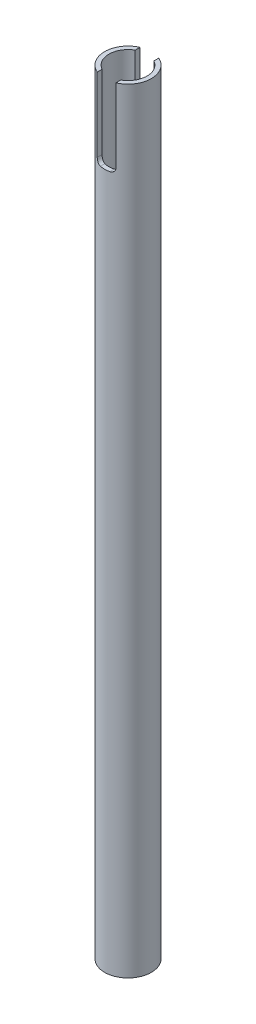
ISO-10303-21;
HEADER;
FILE_DESCRIPTION(('STEP AP214'),'2;1');
FILE_NAME('part.step','',(''),(''),'','','');
FILE_SCHEMA(('AUTOMOTIVE_DESIGN { 1 0 10303 214 1 1 1 1 }'));
ENDSEC;
DATA;
#1=APPLICATION_CONTEXT('core data for automotive mechanical design processes');
#2=APPLICATION_PROTOCOL_DEFINITION('international standard','automotive_design',2000,#1);
#3=PRODUCT_CONTEXT('',#1,'mechanical');
#4=PRODUCT('Part','Part','',(#3));
#5=PRODUCT_RELATED_PRODUCT_CATEGORY('part','',(#4));
#6=PRODUCT_DEFINITION_FORMATION('','',#4);
#7=PRODUCT_DEFINITION_CONTEXT('part definition',#1,'design');
#8=PRODUCT_DEFINITION('design','',#6,#7);
#9=PRODUCT_DEFINITION_SHAPE('','',#8);
#10=(LENGTH_UNIT() NAMED_UNIT(*) SI_UNIT(.MILLI.,.METRE.));
#11=(NAMED_UNIT(*) PLANE_ANGLE_UNIT() SI_UNIT($,.RADIAN.));
#12=(NAMED_UNIT(*) SI_UNIT($,.STERADIAN.) SOLID_ANGLE_UNIT());
#13=UNCERTAINTY_MEASURE_WITH_UNIT(LENGTH_MEASURE(1.E-05),#10,'distance_accuracy_value','');
#14=(GEOMETRIC_REPRESENTATION_CONTEXT(3) GLOBAL_UNCERTAINTY_ASSIGNED_CONTEXT((#13)) GLOBAL_UNIT_ASSIGNED_CONTEXT((#10,
#11,#12)) REPRESENTATION_CONTEXT('',''));
#15=CARTESIAN_POINT('',(0.,0.,0.));
#16=DIRECTION('',(0.,0.,1.));
#17=DIRECTION('',(1.,0.,0.));
#18=AXIS2_PLACEMENT_3D('',#15,#16,#17);
#19=CARTESIAN_POINT('',(3.17499999999999,138.491838411301,0.));
#20=DIRECTION('',(0.,1.,0.));
#21=DIRECTION('',(0.,0.,1.));
#22=AXIS2_PLACEMENT_3D('',#19,#20,#21);
#23=PLANE('',#22);
#24=DIRECTION('',(0.,0.,1.));
#25=VECTOR('',#24,1.);
#26=CARTESIAN_POINT('',(-3.17499999999999,138.491838411301,0.));
#27=LINE('',#26,#25);
#28=CARTESIAN_POINT('',(-3.17499999999999,138.491838411301,-7.2748389157424));
#29=VERTEX_POINT('',#28);
#30=CARTESIAN_POINT('',(-3.17499999999999,138.491838411301,-5.63085690548074));
#31=VERTEX_POINT('',#30);
#32=EDGE_CURVE('E173',#29,#31,#27,.T.);
#33=ORIENTED_EDGE('',*,*,#32,.F.);
#34=CARTESIAN_POINT('',(0.,138.491838411301,0.));
#35=DIRECTION('',(0.,1.,0.));
#36=DIRECTION('',(0.,0.,1.));
#37=AXIS2_PLACEMENT_3D('',#34,#35,#36);
#38=CIRCLE('',#37,7.9375);
#39=CARTESIAN_POINT('',(-3.17499999999999,138.491838411301,7.2748389157424));
#40=VERTEX_POINT('',#39);
#41=EDGE_CURVE('E151',#29,#40,#38,.T.);
#42=ORIENTED_EDGE('',*,*,#41,.T.);
#43=CARTESIAN_POINT('',(-3.17499999999999,138.491838411301,5.63085690548074));
#44=VERTEX_POINT('',#43);
#45=EDGE_CURVE('E171',#44,#40,#27,.T.);
#46=ORIENTED_EDGE('',*,*,#45,.F.);
#47=CARTESIAN_POINT('',(0.,138.491838411301,0.));
#48=DIRECTION('',(0.,1.,0.));
#49=DIRECTION('',(0.,0.,1.));
#50=AXIS2_PLACEMENT_3D('',#47,#48,#49);
#51=CIRCLE('',#50,6.4643);
#52=EDGE_CURVE('E169',#31,#44,#51,.T.);
#53=ORIENTED_EDGE('',*,*,#52,.F.);
#54=EDGE_LOOP('',(#33,#42,#46,#53));
#55=FACE_BOUND('',#54,.T.);
#56=ADVANCED_FACE('F37',(#55),#23,.T.);
#57=CARTESIAN_POINT('',(0.,186.342478713974,0.));
#58=DIRECTION('',(0.,-1.,0.));
#59=DIRECTION('',(0.,0.,-1.));
#60=AXIS2_PLACEMENT_3D('',#57,#58,#59);
#61=CYLINDRICAL_SURFACE('',#60,7.9375);
#62=CARTESIAN_POINT('',(0.,-124.460533205229,0.));
#63=DIRECTION('',(0.,1.,0.));
#64=DIRECTION('',(0.,0.,1.));
#65=AXIS2_PLACEMENT_3D('',#62,#63,#64);
#66=CIRCLE('',#65,7.9375);
#67=CARTESIAN_POINT('',(0.,-124.460533205229,7.9375));
#68=VERTEX_POINT('',#67);
#69=EDGE_CURVE('E154',#68,#68,#66,.T.);
#70=ORIENTED_EDGE('',*,*,#69,.T.);
#71=EDGE_LOOP('',(#70));
#72=FACE_BOUND('',#71,.T.);
#73=CARTESIAN_POINT('',(1.58749999999998,111.821838411301,-7.77712993333659));
#74=CARTESIAN_POINT('',(1.63350676862771,111.821838654892,-7.76774126330065));
#75=CARTESIAN_POINT('',(1.67940359564175,111.823839316009,-7.75794444810862));
#76=CARTESIAN_POINT('',(1.7706803958091,111.831776679327,-7.73762089991974));
#77=CARTESIAN_POINT('',(1.81606050148703,111.837712348075,-7.72709435922088));
#78=CARTESIAN_POINT('',(1.95078228156832,111.861285297326,-7.6945984520111));
#79=CARTESIAN_POINT('',(2.03894812030821,111.884689244249,-7.6716629936863));
#80=CARTESIAN_POINT('',(2.20953807004375,111.94596944142,-7.62428385726794));
#81=CARTESIAN_POINT('',(2.29196515383514,111.98383813168,-7.59984097261638));
#82=CARTESIAN_POINT('',(2.44917385980104,112.072985401722,-7.55064502184107));
#83=CARTESIAN_POINT('',(2.52395227814498,112.124269569167,-7.52589183057165));
#84=CARTESIAN_POINT('',(2.66543932718693,112.240256617122,-7.47696931777062));
#85=CARTESIAN_POINT('',(2.73193883493113,112.305225342237,-7.4528241459836));
#86=CARTESIAN_POINT('',(2.85299322074861,112.44636355607,-7.40732925012122));
#87=CARTESIAN_POINT('',(2.90754767783192,112.522533439402,-7.38597962458243));
#88=CARTESIAN_POINT('',(3.00159155783954,112.682107139886,-7.34825600672415));
#89=CARTESIAN_POINT('',(3.0414245229115,112.765281595146,-7.33177064627855));
#90=CARTESIAN_POINT('',(3.10622330269325,112.938052227247,-7.30455577634144));
#91=CARTESIAN_POINT('',(3.13121458917043,113.027637104415,-7.2938164085495));
#92=CARTESIAN_POINT('',(3.15710194076299,113.166684924183,-7.28263004031742));
#93=CARTESIAN_POINT('',(3.16380495831027,113.214940151024,-7.27971714426164));
#94=CARTESIAN_POINT('',(3.17275416759983,113.311899569453,-7.27581937849741));
#95=CARTESIAN_POINT('',(3.17500392571315,113.360603370371,-7.27483296598248));
#96=CARTESIAN_POINT('',(3.17499999999999,113.409338411301,-7.2748389157424));
#97=B_SPLINE_CURVE_WITH_KNOTS('',3,(#73,#74,#75,#76,#77,#78,#79,#80,#81,#82,#83,#84,#85,#86,#87,
#88,#89,#90,#91,#92,#93,#94,#95,#96),.UNSPECIFIED.,.F.,.F.,(4,2,2,2,2,2,2,2,2,2,2,4),(0.,
0.140770845296606,0.28150473451401,0.562238948643035,0.842826637517777,1.12353138019526,
1.41029752992664,1.69707378478449,1.97665708187306,2.255759151943,2.40195937855944,
2.54804247399298),.UNSPECIFIED.);
#98=CARTESIAN_POINT('',(1.58749999999998,111.821838411301,-7.77712993333659));
#99=VERTEX_POINT('',#98);
#100=CARTESIAN_POINT('',(3.17499999999998,113.409338411301,-7.2748389157424));
#101=VERTEX_POINT('',#100);
#102=EDGE_CURVE('E147',#99,#101,#97,.T.);
#103=ORIENTED_EDGE('',*,*,#102,.T.);
#104=DIRECTION('',(0.,-1.,0.));
#105=VECTOR('',#104,1.);
#106=CARTESIAN_POINT('',(3.175,186.342478713974,-7.2748389157424));
#107=LINE('',#106,#105);
#108=CARTESIAN_POINT('',(3.17499999999999,138.491838411301,-7.2748389157424));
#109=VERTEX_POINT('',#108);
#110=EDGE_CURVE('E134',#101,#109,#107,.F.);
#111=ORIENTED_EDGE('',*,*,#110,.T.);
#112=CARTESIAN_POINT('',(3.17499999999999,138.491838411301,7.2748389157424));
#113=VERTEX_POINT('',#112);
#114=EDGE_CURVE('E141',#113,#109,#38,.T.);
#115=ORIENTED_EDGE('',*,*,#114,.F.);
#116=DIRECTION('',(0.,-1.,0.));
#117=VECTOR('',#116,1.);
#118=CARTESIAN_POINT('',(3.175,186.342478713974,7.2748389157424));
#119=LINE('',#118,#117);
#120=CARTESIAN_POINT('',(3.17499999999998,113.409338411301,7.27483891574241));
#121=VERTEX_POINT('',#120);
#122=EDGE_CURVE('E59',#113,#121,#119,.T.);
#123=ORIENTED_EDGE('',*,*,#122,.T.);
#124=CARTESIAN_POINT('',(3.17499999999999,113.409338411301,7.2748389157424));
#125=CARTESIAN_POINT('',(3.17500168113658,113.366966859319,7.27483586366098));
#126=CARTESIAN_POINT('',(3.17330245165567,113.324617163656,7.27558001702576));
#127=CARTESIAN_POINT('',(3.16653661877878,113.240251349186,7.278528185394));
#128=CARTESIAN_POINT('',(3.16147102917758,113.198235133804,7.28073176088512));
#129=CARTESIAN_POINT('',(3.14133450163408,113.07345277579,7.28945465778902));
#130=CARTESIAN_POINT('',(3.12132308750013,112.9915724567,7.29808678684577));
#131=CARTESIAN_POINT('',(3.06894040253671,112.832714568699,7.32026684625099));
#132=CARTESIAN_POINT('',(3.03657783085926,112.755733593512,7.33381131641251));
#133=CARTESIAN_POINT('',(2.96061234627714,112.608341013137,7.36480545430106));
#134=CARTESIAN_POINT('',(2.91700139314277,112.537934156296,7.38225791423853));
#135=CARTESIAN_POINT('',(2.81767453343913,112.402259867427,7.42075264717217));
#136=CARTESIAN_POINT('',(2.76150754869699,112.337358857665,7.44191980144859));
#137=CARTESIAN_POINT('',(2.63982081610502,112.21767333396,7.48594933347427));
#138=CARTESIAN_POINT('',(2.5742973865362,112.162892821943,7.50881237683835));
#139=CARTESIAN_POINT('',(2.43069507728351,112.061215434871,7.5565684344493));
#140=CARTESIAN_POINT('',(2.35206470826202,112.015110905896,7.58149355937879));
#141=CARTESIAN_POINT('',(2.18789362747877,111.936945301696,7.63048866953837));
#142=CARTESIAN_POINT('',(2.10235659094259,111.90487681509,7.65455909988383));
#143=CARTESIAN_POINT('',(1.94541809174968,111.861051820317,7.6957350743198));
#144=CARTESIAN_POINT('',(1.87491037842446,111.846416715471,7.71322855066072));
#145=CARTESIAN_POINT('',(1.73219113401287,111.826800953617,7.74654000063457));
#146=CARTESIAN_POINT('',(1.65997981118742,111.821819122653,7.76235817778309));
#147=CARTESIAN_POINT('',(1.58749999999998,111.821838411301,7.77712993333659));
#148=B_SPLINE_CURVE_WITH_KNOTS('',3,(#124,#125,#126,#127,#128,#129,#130,#131,#132,#133,#134,
#135,#136,#137,#138,#139,#140,#141,#142,#143,#144,#145,#146,#147),.UNSPECIFIED.,.F.,.F.,(4,2,2,
2,2,2,2,2,2,2,2,4),(0.,0.127031494291929,0.254024749792393,0.506885265042634,0.759568013575099,
1.01243188015946,1.27651034681328,1.54069301498296,1.82289095795801,2.10493971303591,
2.326611113981,2.54825555529033),.UNSPECIFIED.);
#149=CARTESIAN_POINT('',(1.58749999999998,111.821838411301,7.77712993333659));
#150=VERTEX_POINT('',#149);
#151=EDGE_CURVE('E157',#121,#150,#148,.T.);
#152=ORIENTED_EDGE('',*,*,#151,.T.);
#153=CARTESIAN_POINT('',(0.,111.821838411301,0.));
#154=DIRECTION('',(0.,-1.,0.));
#155=DIRECTION('',(0.,0.,-1.));
#156=AXIS2_PLACEMENT_3D('',#153,#154,#155);
#157=CIRCLE('',#156,7.9375);
#158=CARTESIAN_POINT('',(-1.58749999999999,111.821838411301,7.7771299333366));
#159=VERTEX_POINT('',#158);
#160=EDGE_CURVE('E223',#150,#159,#157,.T.);
#161=ORIENTED_EDGE('',*,*,#160,.T.);
#162=CARTESIAN_POINT('',(-1.58749999999999,111.821838411301,7.7771299333366));
#163=CARTESIAN_POINT('',(-1.63350676862771,111.821838654892,7.76774126330065));
#164=CARTESIAN_POINT('',(-1.67940359564175,111.823839316009,7.75794444810862));
#165=CARTESIAN_POINT('',(-1.7706803958091,111.831776679327,7.73762089991974));
#166=CARTESIAN_POINT('',(-1.81606050148703,111.837712348075,7.72709435922088));
#167=CARTESIAN_POINT('',(-1.95078228156832,111.861285297326,7.6945984520111));
#168=CARTESIAN_POINT('',(-2.03894812030821,111.884689244249,7.6716629936863));
#169=CARTESIAN_POINT('',(-2.20953807004375,111.94596944142,7.62428385726794));
#170=CARTESIAN_POINT('',(-2.29196515383514,111.98383813168,7.59984097261638));
#171=CARTESIAN_POINT('',(-2.44917385980104,112.072985401722,7.55064502184107));
#172=CARTESIAN_POINT('',(-2.52395227814498,112.124269569167,7.52589183057165));
#173=CARTESIAN_POINT('',(-2.66543932718692,112.240256617122,7.47696931777063));
#174=CARTESIAN_POINT('',(-2.73193883493112,112.305225342237,7.4528241459836));
#175=CARTESIAN_POINT('',(-2.8529932207486,112.44636355607,7.40732925012122));
#176=CARTESIAN_POINT('',(-2.90754767783192,112.522533439402,7.38597962458243));
#177=CARTESIAN_POINT('',(-3.00159155783954,112.682107139886,7.34825600672415));
#178=CARTESIAN_POINT('',(-3.0414245229115,112.765281595146,7.33177064627855));
#179=CARTESIAN_POINT('',(-3.10622330269325,112.938052227247,7.30455577634144));
#180=CARTESIAN_POINT('',(-3.13121458917043,113.027637104415,7.2938164085495));
#181=CARTESIAN_POINT('',(-3.15710194076299,113.166684924183,7.28263004031742));
#182=CARTESIAN_POINT('',(-3.16380495831027,113.214940151024,7.27971714426164));
#183=CARTESIAN_POINT('',(-3.17275416759983,113.311899569453,7.27581937849741));
#184=CARTESIAN_POINT('',(-3.17500392571315,113.360603370371,7.27483296598248));
#185=CARTESIAN_POINT('',(-3.17499999999999,113.409338411301,7.2748389157424));
#186=B_SPLINE_CURVE_WITH_KNOTS('',3,(#162,#163,#164,#165,#166,#167,#168,#169,#170,#171,#172,
#173,#174,#175,#176,#177,#178,#179,#180,#181,#182,#183,#184,#185),.UNSPECIFIED.,.F.,.F.,(4,2,2,
2,2,2,2,2,2,2,2,4),(0.,0.140770845296606,0.28150473451401,0.562238948643035,0.842826637517777,
1.12353138019526,1.41029752992662,1.69707378478449,1.97665708187306,2.255759151943,
2.40195937855944,2.54804247399298),.UNSPECIFIED.);
#187=CARTESIAN_POINT('',(-3.17499999999999,113.409338411301,7.2748389157424));
#188=VERTEX_POINT('',#187);
#189=EDGE_CURVE('E213',#159,#188,#186,.T.);
#190=ORIENTED_EDGE('',*,*,#189,.T.);
#191=DIRECTION('',(0.,-1.,0.));
#192=VECTOR('',#191,1.);
#193=CARTESIAN_POINT('',(-3.175,186.342478713974,7.2748389157424));
#194=LINE('',#193,#192);
#195=EDGE_CURVE('E277',#188,#40,#194,.F.);
#196=ORIENTED_EDGE('',*,*,#195,.T.);
#197=ORIENTED_EDGE('',*,*,#41,.F.);
#198=DIRECTION('',(0.,-1.,0.));
#199=VECTOR('',#198,1.);
#200=CARTESIAN_POINT('',(-3.175,186.342478713974,-7.2748389157424));
#201=LINE('',#200,#199);
#202=CARTESIAN_POINT('',(-3.17499999999999,113.409338411301,-7.2748389157424));
#203=VERTEX_POINT('',#202);
#204=EDGE_CURVE('E214',#29,#203,#201,.T.);
#205=ORIENTED_EDGE('',*,*,#204,.T.);
#206=CARTESIAN_POINT('',(-3.17499999999999,113.409338411301,-7.2748389157424));
#207=CARTESIAN_POINT('',(-3.17500168113658,113.366966859319,-7.27483586366098));
#208=CARTESIAN_POINT('',(-3.17330245165567,113.324617163656,-7.27558001702576));
#209=CARTESIAN_POINT('',(-3.16653661877878,113.240251349186,-7.278528185394));
#210=CARTESIAN_POINT('',(-3.16147102917758,113.198235133804,-7.28073176088512));
#211=CARTESIAN_POINT('',(-3.14133450163408,113.07345277579,-7.28945465778902));
#212=CARTESIAN_POINT('',(-3.12132308750013,112.9915724567,-7.29808678684577));
#213=CARTESIAN_POINT('',(-3.06894040253671,112.832714568699,-7.32026684625099));
#214=CARTESIAN_POINT('',(-3.03657783085926,112.755733593512,-7.33381131641251));
#215=CARTESIAN_POINT('',(-2.96061234627714,112.608341013137,-7.36480545430106));
#216=CARTESIAN_POINT('',(-2.91700139314277,112.537934156296,-7.38225791423853));
#217=CARTESIAN_POINT('',(-2.81767453343913,112.402259867427,-7.42075264717217));
#218=CARTESIAN_POINT('',(-2.76150754869699,112.337358857665,-7.44191980144859));
#219=CARTESIAN_POINT('',(-2.63982081610502,112.21767333396,-7.48594933347427));
#220=CARTESIAN_POINT('',(-2.5742973865362,112.162892821943,-7.50881237683835));
#221=CARTESIAN_POINT('',(-2.43069507728351,112.061215434871,-7.5565684344493));
#222=CARTESIAN_POINT('',(-2.35206470826202,112.015110905896,-7.58149355937879));
#223=CARTESIAN_POINT('',(-2.18789362747877,111.936945301696,-7.63048866953837));
#224=CARTESIAN_POINT('',(-2.10235659094259,111.90487681509,-7.65455909988383));
#225=CARTESIAN_POINT('',(-1.94541809174968,111.861051820317,-7.6957350743198));
#226=CARTESIAN_POINT('',(-1.87491037842446,111.846416715471,-7.71322855066072));
#227=CARTESIAN_POINT('',(-1.73219113401287,111.826800953617,-7.74654000063457));
#228=CARTESIAN_POINT('',(-1.65997981118742,111.821819122653,-7.76235817778309));
#229=CARTESIAN_POINT('',(-1.58749999999998,111.821838411301,-7.7771299333366));
#230=B_SPLINE_CURVE_WITH_KNOTS('',3,(#206,#207,#208,#209,#210,#211,#212,#213,#214,#215,#216,
#217,#218,#219,#220,#221,#222,#223,#224,#225,#226,#227,#228,#229),.UNSPECIFIED.,.F.,.F.,(4,2,2,
2,2,2,2,2,2,2,2,4),(0.,0.127031494291929,0.254024749792393,0.506885265042634,0.7595680135751,
1.01243188015946,1.27651034681328,1.54069301498296,1.82289095795801,2.10493971303591,
2.326611113981,2.54825555529033),.UNSPECIFIED.);
#231=CARTESIAN_POINT('',(-1.58749999999999,111.821838411301,-7.77712993333659));
#232=VERTEX_POINT('',#231);
#233=EDGE_CURVE('E206',#203,#232,#230,.T.);
#234=ORIENTED_EDGE('',*,*,#233,.T.);
#235=EDGE_CURVE('E222',#232,#99,#157,.T.);
#236=ORIENTED_EDGE('',*,*,#235,.T.);
#237=EDGE_LOOP('',(#103,#111,#115,#123,#152,#161,#190,#196,#197,#205,#234,#236));
#238=FACE_BOUND('',#237,.T.);
#239=ADVANCED_FACE('F39',(#72,#238),#61,.T.);
#240=CARTESIAN_POINT('',(0.,-124.460533205229,0.));
#241=DIRECTION('',(0.,1.,0.));
#242=DIRECTION('',(0.,0.,1.));
#243=AXIS2_PLACEMENT_3D('',#240,#241,#242);
#244=PLANE('',#243);
#245=ORIENTED_EDGE('',*,*,#69,.F.);
#246=EDGE_LOOP('',(#245));
#247=FACE_BOUND('',#246,.T.);
#248=CARTESIAN_POINT('',(0.,-124.460533205229,0.));
#249=DIRECTION('',(0.,1.,0.));
#250=DIRECTION('',(0.,0.,1.));
#251=AXIS2_PLACEMENT_3D('',#248,#249,#250);
#252=CIRCLE('',#251,6.4643);
#253=CARTESIAN_POINT('',(0.,-124.460533205229,6.4643));
#254=VERTEX_POINT('',#253);
#255=EDGE_CURVE('E163',#254,#254,#252,.T.);
#256=ORIENTED_EDGE('',*,*,#255,.T.);
#257=EDGE_LOOP('',(#256));
#258=FACE_BOUND('',#257,.T.);
#259=ADVANCED_FACE('F312',(#247,#258),#244,.F.);
#260=CARTESIAN_POINT('',(0.,186.342478713974,0.));
#261=DIRECTION('',(0.,-1.,0.));
#262=DIRECTION('',(0.,0.,-1.));
#263=AXIS2_PLACEMENT_3D('',#260,#261,#262);
#264=CYLINDRICAL_SURFACE('',#263,6.4643);
#265=DIRECTION('',(0.,-1.,0.));
#266=VECTOR('',#265,1.);
#267=CARTESIAN_POINT('',(-3.175,186.342478713974,5.63085690548073));
#268=LINE('',#267,#266);
#269=CARTESIAN_POINT('',(-3.17499999999999,113.409338411301,5.63085690548074));
#270=VERTEX_POINT('',#269);
#271=EDGE_CURVE('E270',#270,#44,#268,.F.);
#272=ORIENTED_EDGE('',*,*,#271,.F.);
#273=CARTESIAN_POINT('',(-1.58749999999999,111.821838411301,6.26634009929242));
#274=CARTESIAN_POINT('',(-1.63418900680277,111.821838632717,6.25451519937794));
#275=CARTESIAN_POINT('',(-1.68071621150089,111.823898925257,6.2421690242475));
#276=CARTESIAN_POINT('',(-1.77313930969812,111.832047336941,6.21654599792507));
#277=CARTESIAN_POINT('',(-1.81903543834435,111.838133911908,6.20326950527711));
#278=CARTESIAN_POINT('',(-1.95507469082071,111.862244835656,6.16228683989148));
#279=CARTESIAN_POINT('',(-2.04387534201676,111.886121654594,6.13334935224698));
#280=CARTESIAN_POINT('',(-2.2153206150398,111.948406360942,6.07353181019978));
#281=CARTESIAN_POINT('',(-2.29797173444353,111.986798642723,6.04265387160464));
#282=CARTESIAN_POINT('',(-2.45546303738962,112.077033596618,5.98038883139863));
#283=CARTESIAN_POINT('',(-2.53029702370293,112.128886828438,5.94900134826913));
#284=CARTESIAN_POINT('',(-2.67287075398232,112.247010545311,5.88635884745835));
#285=CARTESIAN_POINT('',(-2.74025626996522,112.31373443095,5.8551496317366));
#286=CARTESIAN_POINT('',(-2.86271368076048,112.459071692322,5.79626340236598));
#287=CARTESIAN_POINT('',(-2.91778558227084,112.537685061587,5.76858638679578));
#288=CARTESIAN_POINT('',(-3.01168872656628,112.701906995832,5.72010524984433));
#289=CARTESIAN_POINT('',(-3.05104502216774,112.787149599172,5.6990849029132));
#290=CARTESIAN_POINT('',(-3.11430373465244,112.964550393652,5.66476886814872));
#291=CARTESIAN_POINT('',(-3.13824572360374,113.056690192995,5.65145340907631));
#292=CARTESIAN_POINT('',(-3.16081362599345,113.193183200869,5.63883740321028));
#293=CARTESIAN_POINT('',(-3.16612512648614,113.236191947936,5.63585394797715));
#294=CARTESIAN_POINT('',(-3.17321828948629,113.32256998854,5.63186201493138));
#295=CARTESIAN_POINT('',(-3.17500157254308,113.365939107359,5.63085263040866));
#296=CARTESIAN_POINT('',(-3.17499999999999,113.409338411301,5.63085690548074));
#297=B_SPLINE_CURVE_WITH_KNOTS('',3,(#273,#274,#275,#276,#277,#278,#279,#280,#281,#282,#283,
#284,#285,#286,#287,#288,#289,#290,#291,#292,#293,#294,#295,#296),.UNSPECIFIED.,.F.,.F.,(4,2,2,
2,2,2,2,2,2,2,2,4),(0.,0.1443887409403,0.288722137366154,0.576452128922377,0.863873656489907,
1.15152134248761,1.44956694911565,1.74761239362143,2.03464137858757,2.32093052452345,
2.45108160789036,2.58117289753275),.UNSPECIFIED.);
#298=CARTESIAN_POINT('',(-1.58749999999999,111.821838411301,6.26634009929242));
#299=VERTEX_POINT('',#298);
#300=EDGE_CURVE('E200',#299,#270,#297,.T.);
#301=ORIENTED_EDGE('',*,*,#300,.F.);
#302=CARTESIAN_POINT('',(0.,111.821838411301,0.));
#303=DIRECTION('',(0.,-1.,0.));
#304=DIRECTION('',(0.,0.,-1.));
#305=AXIS2_PLACEMENT_3D('',#302,#303,#304);
#306=CIRCLE('',#305,6.4643);
#307=CARTESIAN_POINT('',(1.58749999999998,111.821838411301,6.26634009929241));
#308=VERTEX_POINT('',#307);
#309=EDGE_CURVE('E52',#308,#299,#306,.T.);
#310=ORIENTED_EDGE('',*,*,#309,.F.);
#311=CARTESIAN_POINT('',(3.17499999999999,113.409338411301,5.63085690548074));
#312=CARTESIAN_POINT('',(3.1750026594243,113.368181580626,5.6308524315094));
#313=CARTESIAN_POINT('',(3.17339835018605,113.327047058452,5.63176028239597));
#314=CARTESIAN_POINT('',(3.16701766507686,113.245121243111,5.63535215701951));
#315=CARTESIAN_POINT('',(3.16224273305129,113.20432980227,5.63803537228505));
#316=CARTESIAN_POINT('',(3.14329664507893,113.083334575497,5.64863522411123));
#317=CARTESIAN_POINT('',(3.12450305374454,113.004022523056,5.65910325483873));
#318=CARTESIAN_POINT('',(3.07549165040548,112.850272628557,5.68588522764518));
#319=CARTESIAN_POINT('',(3.04528974537458,112.775828168238,5.70219102829141));
#320=CARTESIAN_POINT('',(2.97460119282054,112.633160547241,5.73938277272119));
#321=CARTESIAN_POINT('',(2.93410271969419,112.564944663351,5.76027397904374));
#322=CARTESIAN_POINT('',(2.84103773378419,112.43166669509,5.80676804025648));
#323=CARTESIAN_POINT('',(2.78784532739571,112.367120533028,5.83259254506423));
#324=CARTESIAN_POINT('',(2.67254263369959,112.24755382299,5.88631786935969));
#325=CARTESIAN_POINT('',(2.61042818908351,112.192537742157,5.91421965383983));
#326=CARTESIAN_POINT('',(2.47143371409534,112.08752089385,5.97373371686979));
#327=CARTESIAN_POINT('',(2.3936829570158,112.038710474294,6.00542032126397));
#328=CARTESIAN_POINT('',(2.23068225215678,111.955083076243,6.0678536497522));
#329=CARTESIAN_POINT('',(2.14543609512388,111.92025907327,6.09860083846707));
#330=CARTESIAN_POINT('',(1.9821612058402,111.869661799638,6.15341243852269));
#331=CARTESIAN_POINT('',(1.90486553835024,111.851864888703,6.17780100436403));
#332=CARTESIAN_POINT('',(1.74771289593286,111.827935720894,6.22410888754504));
#333=CARTESIAN_POINT('',(1.6678539650917,111.82181259781,6.24602625877212));
#334=CARTESIAN_POINT('',(1.58749999999998,111.821838411301,6.26634009929241));
#335=B_SPLINE_CURVE_WITH_KNOTS('',3,(#311,#312,#313,#314,#315,#316,#317,#318,#319,#320,#321,
#322,#323,#324,#325,#326,#327,#328,#329,#330,#331,#332,#333,#334),.UNSPECIFIED.,.F.,.F.,(4,2,2,
2,2,2,2,2,2,2,2,4),(0.,0.123386261727151,0.246716374037819,0.491934980105696,0.736812924701856,
0.981973392060174,1.24352761602778,1.50520411142377,1.7952497086635,2.08514945193375,
2.33322496948238,2.58149450643057),.UNSPECIFIED.);
#336=CARTESIAN_POINT('',(3.17499999999998,113.409338411301,5.63085690548074));
#337=VERTEX_POINT('',#336);
#338=EDGE_CURVE('E12',#337,#308,#335,.T.);
#339=ORIENTED_EDGE('',*,*,#338,.F.);
#340=DIRECTION('',(0.,-1.,0.));
#341=VECTOR('',#340,1.);
#342=CARTESIAN_POINT('',(3.175,186.342478713974,5.63085690548073));
#343=LINE('',#342,#341);
#344=CARTESIAN_POINT('',(3.17499999999999,138.491838411301,5.63085690548074));
#345=VERTEX_POINT('',#344);
#346=EDGE_CURVE('E148',#345,#337,#343,.T.);
#347=ORIENTED_EDGE('',*,*,#346,.F.);
#348=CARTESIAN_POINT('',(3.17499999999999,138.491838411301,-5.63085690548074));
#349=VERTEX_POINT('',#348);
#350=EDGE_CURVE('E166',#345,#349,#51,.T.);
#351=ORIENTED_EDGE('',*,*,#350,.T.);
#352=DIRECTION('',(0.,-1.,0.));
#353=VECTOR('',#352,1.);
#354=CARTESIAN_POINT('',(3.175,186.342478713974,-5.63085690548073));
#355=LINE('',#354,#353);
#356=CARTESIAN_POINT('',(3.17499999999998,113.409338411301,-5.63085690548074));
#357=VERTEX_POINT('',#356);
#358=EDGE_CURVE('E67',#357,#349,#355,.F.);
#359=ORIENTED_EDGE('',*,*,#358,.F.);
#360=CARTESIAN_POINT('',(1.58749999999998,111.821838411301,-6.26634009929241));
#361=CARTESIAN_POINT('',(1.63418900680277,111.821838632717,-6.25451519937794));
#362=CARTESIAN_POINT('',(1.68071621150089,111.823898925257,-6.2421690242475));
#363=CARTESIAN_POINT('',(1.77313930969812,111.832047336941,-6.21654599792507));
#364=CARTESIAN_POINT('',(1.81903543834435,111.838133911908,-6.20326950527711));
#365=CARTESIAN_POINT('',(1.95507469082071,111.862244835656,-6.16228683989148));
#366=CARTESIAN_POINT('',(2.04387534201676,111.886121654594,-6.13334935224698));
#367=CARTESIAN_POINT('',(2.2153206150398,111.948406360942,-6.07353181019978));
#368=CARTESIAN_POINT('',(2.29797173444353,111.986798642723,-6.04265387160464));
#369=CARTESIAN_POINT('',(2.45546303738962,112.077033596618,-5.98038883139864));
#370=CARTESIAN_POINT('',(2.53029702370293,112.128886828438,-5.94900134826913));
#371=CARTESIAN_POINT('',(2.67287075398232,112.247010545311,-5.88635884745835));
#372=CARTESIAN_POINT('',(2.74025626996521,112.31373443095,-5.8551496317366));
#373=CARTESIAN_POINT('',(2.86271368076047,112.459071692322,-5.79626340236598));
#374=CARTESIAN_POINT('',(2.91778558227083,112.537685061587,-5.76858638679578));
#375=CARTESIAN_POINT('',(3.01168872656628,112.701906995832,-5.72010524984433));
#376=CARTESIAN_POINT('',(3.05104502216774,112.787149599172,-5.6990849029132));
#377=CARTESIAN_POINT('',(3.11430373465244,112.964550393652,-5.66476886814872));
#378=CARTESIAN_POINT('',(3.13824572360374,113.056690192995,-5.65145340907631));
#379=CARTESIAN_POINT('',(3.16081362599345,113.193183200869,-5.63883740321028));
#380=CARTESIAN_POINT('',(3.16612512648614,113.236191947936,-5.63585394797715));
#381=CARTESIAN_POINT('',(3.17321828948629,113.32256998854,-5.63186201493138));
#382=CARTESIAN_POINT('',(3.17500157254308,113.365939107359,-5.63085263040866));
#383=CARTESIAN_POINT('',(3.17499999999999,113.409338411301,-5.63085690548074));
#384=B_SPLINE_CURVE_WITH_KNOTS('',3,(#360,#361,#362,#363,#364,#365,#366,#367,#368,#369,#370,
#371,#372,#373,#374,#375,#376,#377,#378,#379,#380,#381,#382,#383),.UNSPECIFIED.,.F.,.F.,(4,2,2,
2,2,2,2,2,2,2,2,4),(0.,0.1443887409403,0.288722137366153,0.576452128922376,0.863873656489907,
1.15152134248761,1.44956694911564,1.74761239362143,2.03464137858757,2.32093052452345,
2.45108160789036,2.58117289753275),.UNSPECIFIED.);
#385=CARTESIAN_POINT('',(1.58749999999998,111.821838411301,-6.26634009929241));
#386=VERTEX_POINT('',#385);
#387=EDGE_CURVE('E237',#386,#357,#384,.T.);
#388=ORIENTED_EDGE('',*,*,#387,.F.);
#389=CARTESIAN_POINT('',(-1.58749999999999,111.821838411301,-6.26634009929241));
#390=VERTEX_POINT('',#389);
#391=EDGE_CURVE('E181',#390,#386,#306,.T.);
#392=ORIENTED_EDGE('',*,*,#391,.F.);
#393=CARTESIAN_POINT('',(-3.17499999999999,113.409338411301,-5.63085690548073));
#394=CARTESIAN_POINT('',(-3.1750026594243,113.368181580626,-5.6308524315094));
#395=CARTESIAN_POINT('',(-3.17339835018605,113.327047058452,-5.63176028239597));
#396=CARTESIAN_POINT('',(-3.16701766507686,113.245121243111,-5.63535215701951));
#397=CARTESIAN_POINT('',(-3.16224273305129,113.20432980227,-5.63803537228505));
#398=CARTESIAN_POINT('',(-3.14329664507893,113.083334575497,-5.64863522411123));
#399=CARTESIAN_POINT('',(-3.12450305374454,113.004022523056,-5.65910325483873));
#400=CARTESIAN_POINT('',(-3.07549165040548,112.850272628557,-5.68588522764518));
#401=CARTESIAN_POINT('',(-3.04528974537458,112.775828168238,-5.70219102829141));
#402=CARTESIAN_POINT('',(-2.97460119282054,112.633160547241,-5.73938277272119));
#403=CARTESIAN_POINT('',(-2.93410271969419,112.564944663351,-5.76027397904375));
#404=CARTESIAN_POINT('',(-2.84103773378419,112.43166669509,-5.80676804025648));
#405=CARTESIAN_POINT('',(-2.78784532739571,112.367120533028,-5.83259254506423));
#406=CARTESIAN_POINT('',(-2.67254263369959,112.24755382299,-5.88631786935969));
#407=CARTESIAN_POINT('',(-2.6104281890835,112.192537742157,-5.91421965383983));
#408=CARTESIAN_POINT('',(-2.47143371409534,112.08752089385,-5.97373371686979));
#409=CARTESIAN_POINT('',(-2.39368295701581,112.038710474294,-6.00542032126397));
#410=CARTESIAN_POINT('',(-2.23068225215679,111.955083076243,-6.0678536497522));
#411=CARTESIAN_POINT('',(-2.14543609512389,111.92025907327,-6.09860083846707));
#412=CARTESIAN_POINT('',(-1.9821612058402,111.869661799638,-6.15341243852269));
#413=CARTESIAN_POINT('',(-1.90486553835024,111.851864888703,-6.17780100436403));
#414=CARTESIAN_POINT('',(-1.74771289593286,111.827935720894,-6.22410888754504));
#415=CARTESIAN_POINT('',(-1.6678539650917,111.82181259781,-6.24602625877212));
#416=CARTESIAN_POINT('',(-1.58749999999998,111.821838411301,-6.26634009929241));
#417=B_SPLINE_CURVE_WITH_KNOTS('',3,(#393,#394,#395,#396,#397,#398,#399,#400,#401,#402,#403,
#404,#405,#406,#407,#408,#409,#410,#411,#412,#413,#414,#415,#416),.UNSPECIFIED.,.F.,.F.,(4,2,2,
2,2,2,2,2,2,2,2,4),(0.,0.123386261727165,0.246716374037819,0.491934980105696,0.736812924701857,
0.981973392060174,1.24352761602778,1.50520411142377,1.7952497086635,2.08514945193375,
2.33322496948238,2.58149450643057),.UNSPECIFIED.);
#418=CARTESIAN_POINT('',(-3.17499999999999,113.409338411301,-5.63085690548073));
#419=VERTEX_POINT('',#418);
#420=EDGE_CURVE('E174',#419,#390,#417,.T.);
#421=ORIENTED_EDGE('',*,*,#420,.F.);
#422=DIRECTION('',(0.,-1.,0.));
#423=VECTOR('',#422,1.);
#424=CARTESIAN_POINT('',(-3.175,186.342478713974,-5.63085690548073));
#425=LINE('',#424,#423);
#426=EDGE_CURVE('E275',#31,#419,#425,.T.);
#427=ORIENTED_EDGE('',*,*,#426,.F.);
#428=ORIENTED_EDGE('',*,*,#52,.T.);
#429=EDGE_LOOP('',(#272,#301,#310,#339,#347,#351,#359,#388,#392,#421,#427,#428));
#430=FACE_BOUND('',#429,.T.);
#431=ORIENTED_EDGE('',*,*,#255,.F.);
#432=EDGE_LOOP('',(#431));
#433=FACE_BOUND('',#432,.T.);
#434=ADVANCED_FACE('F183',(#430,#433),#264,.F.);
#435=DIRECTION('',(0.,0.,-1.));
#436=VECTOR('',#435,1.);
#437=CARTESIAN_POINT('',(3.17499999999999,138.491838411301,0.));
#438=LINE('',#437,#436);
#439=EDGE_CURVE('E140',#113,#345,#438,.T.);
#440=ORIENTED_EDGE('',*,*,#439,.F.);
#441=ORIENTED_EDGE('',*,*,#114,.T.);
#442=EDGE_CURVE('E131',#349,#109,#438,.T.);
#443=ORIENTED_EDGE('',*,*,#442,.F.);
#444=ORIENTED_EDGE('',*,*,#350,.F.);
#445=EDGE_LOOP('',(#440,#441,#443,#444));
#446=FACE_BOUND('',#445,.T.);
#447=ADVANCED_FACE('F150',(#446),#23,.T.);
#448=CARTESIAN_POINT('',(3.17499999999999,138.491838411301,-7.9375));
#449=DIRECTION('',(1.,0.,0.));
#450=DIRECTION('',(0.,1.,0.));
#451=AXIS2_PLACEMENT_3D('',#448,#449,#450);
#452=PLANE('',#451);
#453=DIRECTION('',(0.,0.,1.));
#454=VECTOR('',#453,1.);
#455=CARTESIAN_POINT('',(3.17499999999998,113.409338411301,-7.9375));
#456=LINE('',#455,#454);
#457=EDGE_CURVE('E292',#101,#357,#456,.T.);
#458=ORIENTED_EDGE('',*,*,#457,.T.);
#459=ORIENTED_EDGE('',*,*,#358,.T.);
#460=ORIENTED_EDGE('',*,*,#442,.T.);
#461=ORIENTED_EDGE('',*,*,#110,.F.);
#462=EDGE_LOOP('',(#458,#459,#460,#461));
#463=FACE_BOUND('',#462,.T.);
#464=ADVANCED_FACE('F133',(#463),#452,.F.);
#465=CARTESIAN_POINT('',(-3.17499999999999,138.491838411301,-7.9375));
#466=DIRECTION('',(-1.,0.,0.));
#467=DIRECTION('',(0.,-1.,0.));
#468=AXIS2_PLACEMENT_3D('',#465,#466,#467);
#469=PLANE('',#468);
#470=ORIENTED_EDGE('',*,*,#32,.T.);
#471=ORIENTED_EDGE('',*,*,#426,.T.);
#472=DIRECTION('',(0.,0.,1.));
#473=VECTOR('',#472,1.);
#474=CARTESIAN_POINT('',(-3.17499999999999,113.409338411301,-7.9375));
#475=LINE('',#474,#473);
#476=EDGE_CURVE('E265',#203,#419,#475,.T.);
#477=ORIENTED_EDGE('',*,*,#476,.F.);
#478=ORIENTED_EDGE('',*,*,#204,.F.);
#479=EDGE_LOOP('',(#470,#471,#477,#478));
#480=FACE_BOUND('',#479,.T.);
#481=ADVANCED_FACE('F195',(#480),#469,.F.);
#482=CARTESIAN_POINT('',(-1.58749999999999,113.409338411301,-7.9375));
#483=DIRECTION('',(0.,0.,1.));
#484=DIRECTION('',(1.,0.,0.));
#485=AXIS2_PLACEMENT_3D('',#482,#483,#484);
#486=CYLINDRICAL_SURFACE('',#485,1.5875);
#487=ORIENTED_EDGE('',*,*,#476,.T.);
#488=ORIENTED_EDGE('',*,*,#420,.T.);
#489=DIRECTION('',(0.,0.,1.));
#490=VECTOR('',#489,1.);
#491=CARTESIAN_POINT('',(-1.58749999999999,111.821838411301,-7.9375));
#492=LINE('',#491,#490);
#493=EDGE_CURVE('E264',#232,#390,#492,.T.);
#494=ORIENTED_EDGE('',*,*,#493,.F.);
#495=ORIENTED_EDGE('',*,*,#233,.F.);
#496=EDGE_LOOP('',(#487,#488,#494,#495));
#497=FACE_BOUND('',#496,.T.);
#498=ADVANCED_FACE('F194',(#497),#486,.F.);
#499=CARTESIAN_POINT('',(-1.58749999999999,111.821838411301,-7.9375));
#500=DIRECTION('',(0.,-1.,0.));
#501=DIRECTION('',(0.,0.,-1.));
#502=AXIS2_PLACEMENT_3D('',#499,#500,#501);
#503=PLANE('',#502);
#504=ORIENTED_EDGE('',*,*,#235,.F.);
#505=ORIENTED_EDGE('',*,*,#493,.T.);
#506=ORIENTED_EDGE('',*,*,#391,.T.);
#507=DIRECTION('',(0.,0.,1.));
#508=VECTOR('',#507,1.);
#509=CARTESIAN_POINT('',(1.58749999999998,111.821838411301,-7.9375));
#510=LINE('',#509,#508);
#511=EDGE_CURVE('E293',#99,#386,#510,.T.);
#512=ORIENTED_EDGE('',*,*,#511,.F.);
#513=EDGE_LOOP('',(#504,#505,#506,#512));
#514=FACE_BOUND('',#513,.T.);
#515=ADVANCED_FACE('F303',(#514),#503,.F.);
#516=CARTESIAN_POINT('',(1.58749999999999,113.409338411301,-7.9375));
#517=DIRECTION('',(0.,0.,1.));
#518=DIRECTION('',(1.,0.,0.));
#519=AXIS2_PLACEMENT_3D('',#516,#517,#518);
#520=CYLINDRICAL_SURFACE('',#519,1.5875);
#521=ORIENTED_EDGE('',*,*,#511,.T.);
#522=ORIENTED_EDGE('',*,*,#387,.T.);
#523=ORIENTED_EDGE('',*,*,#457,.F.);
#524=ORIENTED_EDGE('',*,*,#102,.F.);
#525=EDGE_LOOP('',(#521,#522,#523,#524));
#526=FACE_BOUND('',#525,.T.);
#527=ADVANCED_FACE('F232',(#526),#520,.F.);
#528=EDGE_CURVE('E290',#337,#121,#456,.T.);
#529=ORIENTED_EDGE('',*,*,#528,.F.);
#530=ORIENTED_EDGE('',*,*,#338,.T.);
#531=EDGE_CURVE('E257',#308,#150,#510,.T.);
#532=ORIENTED_EDGE('',*,*,#531,.T.);
#533=ORIENTED_EDGE('',*,*,#151,.F.);
#534=EDGE_LOOP('',(#529,#530,#532,#533));
#535=FACE_BOUND('',#534,.T.);
#536=ADVANCED_FACE('F228',(#535),#520,.F.);
#537=ORIENTED_EDGE('',*,*,#531,.F.);
#538=ORIENTED_EDGE('',*,*,#309,.T.);
#539=EDGE_CURVE('E255',#299,#159,#492,.T.);
#540=ORIENTED_EDGE('',*,*,#539,.T.);
#541=ORIENTED_EDGE('',*,*,#160,.F.);
#542=EDGE_LOOP('',(#537,#538,#540,#541));
#543=FACE_BOUND('',#542,.T.);
#544=ADVANCED_FACE('F192',(#543),#503,.F.);
#545=ORIENTED_EDGE('',*,*,#539,.F.);
#546=ORIENTED_EDGE('',*,*,#300,.T.);
#547=EDGE_CURVE('E297',#270,#188,#475,.T.);
#548=ORIENTED_EDGE('',*,*,#547,.T.);
#549=ORIENTED_EDGE('',*,*,#189,.F.);
#550=EDGE_LOOP('',(#545,#546,#548,#549));
#551=FACE_BOUND('',#550,.T.);
#552=ADVANCED_FACE('F186',(#551),#486,.F.);
#553=ORIENTED_EDGE('',*,*,#547,.F.);
#554=ORIENTED_EDGE('',*,*,#271,.T.);
#555=ORIENTED_EDGE('',*,*,#45,.T.);
#556=ORIENTED_EDGE('',*,*,#195,.F.);
#557=EDGE_LOOP('',(#553,#554,#555,#556));
#558=FACE_BOUND('',#557,.T.);
#559=ADVANCED_FACE('F191',(#558),#469,.F.);
#560=ORIENTED_EDGE('',*,*,#439,.T.);
#561=ORIENTED_EDGE('',*,*,#346,.T.);
#562=ORIENTED_EDGE('',*,*,#528,.T.);
#563=ORIENTED_EDGE('',*,*,#122,.F.);
#564=EDGE_LOOP('',(#560,#561,#562,#563));
#565=FACE_BOUND('',#564,.T.);
#566=ADVANCED_FACE('F234',(#565),#452,.F.);
#567=CLOSED_SHELL('',(#56,#239,#259,#434,#447,#464,#481,#498,#515,#527,#536,#544,#552,#559,#566));
#568=MANIFOLD_SOLID_BREP('B2',#567);
#569=ADVANCED_BREP_SHAPE_REPRESENTATION('',(#18,#568),#14);
#570=SHAPE_DEFINITION_REPRESENTATION(#9,#569);
ENDSEC;
END-ISO-10303-21;
